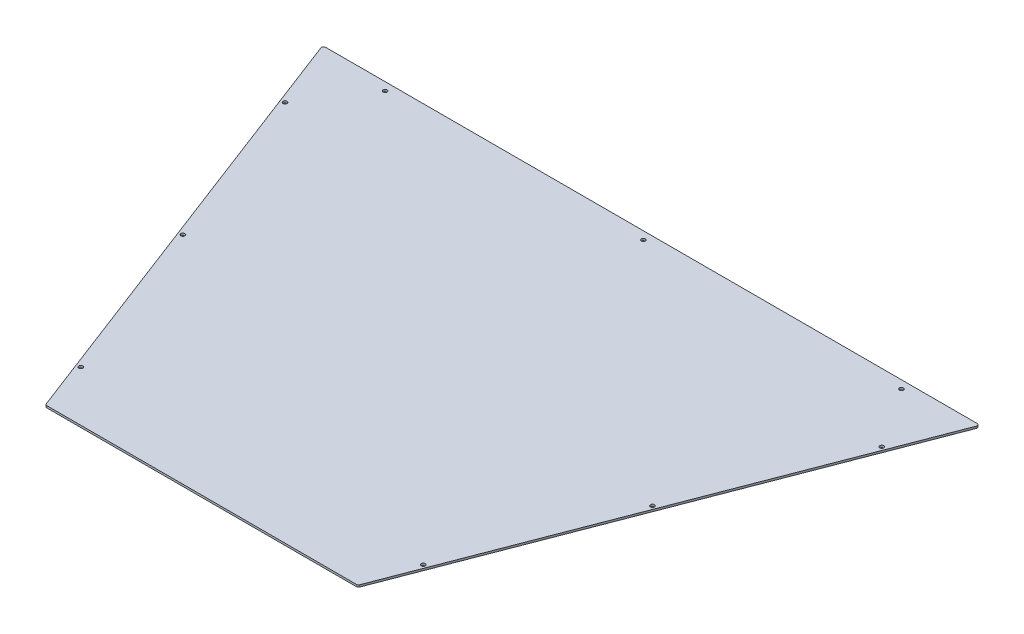
ISO-10303-21;
HEADER;
FILE_DESCRIPTION(('STEP AP214'),'2;1');
FILE_NAME('part.step','',(''),(''),'','','');
FILE_SCHEMA(('AUTOMOTIVE_DESIGN { 1 0 10303 214 1 1 1 1 }'));
ENDSEC;
DATA;
#1=APPLICATION_CONTEXT('core data for automotive mechanical design processes');
#2=APPLICATION_PROTOCOL_DEFINITION('international standard','automotive_design',2000,#1);
#3=PRODUCT_CONTEXT('',#1,'mechanical');
#4=PRODUCT('Part','Part','',(#3));
#5=PRODUCT_RELATED_PRODUCT_CATEGORY('part','',(#4));
#6=PRODUCT_DEFINITION_FORMATION('','',#4);
#7=PRODUCT_DEFINITION_CONTEXT('part definition',#1,'design');
#8=PRODUCT_DEFINITION('design','',#6,#7);
#9=PRODUCT_DEFINITION_SHAPE('','',#8);
#10=(LENGTH_UNIT() NAMED_UNIT(*) SI_UNIT(.MILLI.,.METRE.));
#11=(NAMED_UNIT(*) PLANE_ANGLE_UNIT() SI_UNIT($,.RADIAN.));
#12=(NAMED_UNIT(*) SI_UNIT($,.STERADIAN.) SOLID_ANGLE_UNIT());
#13=UNCERTAINTY_MEASURE_WITH_UNIT(LENGTH_MEASURE(1.E-05),#10,'distance_accuracy_value','');
#14=(GEOMETRIC_REPRESENTATION_CONTEXT(3) GLOBAL_UNCERTAINTY_ASSIGNED_CONTEXT((#13)) GLOBAL_UNIT_ASSIGNED_CONTEXT((#10,
#11,#12)) REPRESENTATION_CONTEXT('',''));
#15=CARTESIAN_POINT('',(0.,0.,0.));
#16=DIRECTION('',(0.,0.,1.));
#17=DIRECTION('',(1.,0.,0.));
#18=AXIS2_PLACEMENT_3D('',#15,#16,#17);
#19=CARTESIAN_POINT('',(-517.525,3.175,-708.025));
#20=DIRECTION('',(0.933656419059452,0.,-0.358169919380566));
#21=DIRECTION('',(-0.358169919380566,0.,-0.933656419059452));
#22=AXIS2_PLACEMENT_3D('',#19,#20,#21);
#23=PLANE('',#22);
#24=DIRECTION('',(0.358169919380566,0.,0.933656419059452));
#25=VECTOR('',#24,1.);
#26=CARTESIAN_POINT('',(-517.525,3.175,-708.025));
#27=LINE('',#26,#25);
#28=CARTESIAN_POINT('',(-515.870754892375,3.175,-703.712810505967));
#29=VERTEX_POINT('',#28);
#30=CARTESIAN_POINT('',(-246.693707478582,3.175,-2.03781050596674));
#31=VERTEX_POINT('',#30);
#32=EDGE_CURVE('E126',#29,#31,#27,.T.);
#33=ORIENTED_EDGE('',*,*,#32,.F.);
#34=DIRECTION('',(0.,-1.,0.));
#35=VECTOR('',#34,1.);
#36=CARTESIAN_POINT('',(-515.870754892375,3.175,-703.712810505967));
#37=LINE('',#36,#35);
#38=CARTESIAN_POINT('',(-515.870754892375,0.,-703.712810505967));
#39=VERTEX_POINT('',#38);
#40=EDGE_CURVE('E152',#29,#39,#37,.T.);
#41=ORIENTED_EDGE('',*,*,#40,.T.);
#42=DIRECTION('',(0.358169919380566,0.,0.933656419059452));
#43=VECTOR('',#42,1.);
#44=CARTESIAN_POINT('',(-517.525,0.,-708.025));
#45=LINE('',#44,#43);
#46=CARTESIAN_POINT('',(-246.693707478582,0.,-2.03781050596674));
#47=VERTEX_POINT('',#46);
#48=EDGE_CURVE('E158',#39,#47,#45,.T.);
#49=ORIENTED_EDGE('',*,*,#48,.T.);
#50=DIRECTION('',(0.,-1.,0.));
#51=VECTOR('',#50,1.);
#52=CARTESIAN_POINT('',(-246.693707478582,3.175,-2.03781050596674));
#53=LINE('',#52,#51);
#54=EDGE_CURVE('E150',#47,#31,#53,.F.);
#55=ORIENTED_EDGE('',*,*,#54,.T.);
#56=EDGE_LOOP('',(#33,#41,#49,#55));
#57=FACE_BOUND('',#56,.T.);
#58=ADVANCED_FACE('F34',(#57),#23,.F.);
#59=CARTESIAN_POINT('',(-245.911961206897,3.175,0.));
#60=DIRECTION('',(0.,0.,-1.));
#61=DIRECTION('',(-1.,0.,0.));
#62=AXIS2_PLACEMENT_3D('',#59,#60,#61);
#63=PLANE('',#62);
#64=DIRECTION('',(1.,0.,0.));
#65=VECTOR('',#64,1.);
#66=CARTESIAN_POINT('',(-245.911961206897,3.175,0.));
#67=LINE('',#66,#65);
#68=CARTESIAN_POINT('',(-243.729348348068,3.175,0.));
#69=VERTEX_POINT('',#68);
#70=CARTESIAN_POINT('',(243.729348348068,3.175,0.));
#71=VERTEX_POINT('',#70);
#72=EDGE_CURVE('E129',#69,#71,#67,.T.);
#73=ORIENTED_EDGE('',*,*,#72,.F.);
#74=DIRECTION('',(0.,-1.,0.));
#75=VECTOR('',#74,1.);
#76=CARTESIAN_POINT('',(-243.729348348068,3.175,0.));
#77=LINE('',#76,#75);
#78=CARTESIAN_POINT('',(-243.729348348068,0.,0.));
#79=VERTEX_POINT('',#78);
#80=EDGE_CURVE('E11',#69,#79,#77,.T.);
#81=ORIENTED_EDGE('',*,*,#80,.T.);
#82=DIRECTION('',(1.,0.,0.));
#83=VECTOR('',#82,1.);
#84=CARTESIAN_POINT('',(-245.911961206897,0.,0.));
#85=LINE('',#84,#83);
#86=CARTESIAN_POINT('',(243.729348348068,0.,0.));
#87=VERTEX_POINT('',#86);
#88=EDGE_CURVE('E131',#79,#87,#85,.T.);
#89=ORIENTED_EDGE('',*,*,#88,.T.);
#90=DIRECTION('',(0.,-1.,0.));
#91=VECTOR('',#90,1.);
#92=CARTESIAN_POINT('',(243.729348348068,3.175,0.));
#93=LINE('',#92,#91);
#94=EDGE_CURVE('E42',#87,#71,#93,.F.);
#95=ORIENTED_EDGE('',*,*,#94,.T.);
#96=EDGE_LOOP('',(#73,#81,#89,#95));
#97=FACE_BOUND('',#96,.T.);
#98=ADVANCED_FACE('F252',(#97),#63,.F.);
#99=CARTESIAN_POINT('',(245.911961206897,3.175,0.));
#100=DIRECTION('',(-0.933656419059452,0.,-0.358169919380566));
#101=DIRECTION('',(-0.358169919380566,0.,0.933656419059452));
#102=AXIS2_PLACEMENT_3D('',#99,#100,#101);
#103=PLANE('',#102);
#104=DIRECTION('',(0.358169919380566,0.,-0.933656419059452));
#105=VECTOR('',#104,1.);
#106=CARTESIAN_POINT('',(245.911961206897,0.,0.));
#107=LINE('',#106,#105);
#108=CARTESIAN_POINT('',(246.693707478582,0.,-2.03781050596671));
#109=VERTEX_POINT('',#108);
#110=CARTESIAN_POINT('',(515.870754892375,0.,-703.712810505967));
#111=VERTEX_POINT('',#110);
#112=EDGE_CURVE('E127',#109,#111,#107,.T.);
#113=ORIENTED_EDGE('',*,*,#112,.T.);
#114=DIRECTION('',(0.,-1.,0.));
#115=VECTOR('',#114,1.);
#116=CARTESIAN_POINT('',(515.870754892375,3.175,-703.712810505967));
#117=LINE('',#116,#115);
#118=CARTESIAN_POINT('',(515.870754892375,3.175,-703.712810505967));
#119=VERTEX_POINT('',#118);
#120=EDGE_CURVE('E105',#111,#119,#117,.F.);
#121=ORIENTED_EDGE('',*,*,#120,.T.);
#122=DIRECTION('',(0.358169919380566,0.,-0.933656419059452));
#123=VECTOR('',#122,1.);
#124=CARTESIAN_POINT('',(245.911961206897,3.175,0.));
#125=LINE('',#124,#123);
#126=CARTESIAN_POINT('',(246.693707478582,3.175,-2.03781050596671));
#127=VERTEX_POINT('',#126);
#128=EDGE_CURVE('E170',#127,#119,#125,.T.);
#129=ORIENTED_EDGE('',*,*,#128,.F.);
#130=DIRECTION('',(0.,-1.,0.));
#131=VECTOR('',#130,1.);
#132=CARTESIAN_POINT('',(246.693707478582,3.175,-2.0378105059667));
#133=LINE('',#132,#131);
#134=EDGE_CURVE('E110',#127,#109,#133,.T.);
#135=ORIENTED_EDGE('',*,*,#134,.T.);
#136=EDGE_LOOP('',(#113,#121,#129,#135));
#137=FACE_BOUND('',#136,.T.);
#138=ADVANCED_FACE('F250',(#137),#103,.F.);
#139=CARTESIAN_POINT('',(517.525,3.175,-708.025));
#140=DIRECTION('',(0.,0.,1.));
#141=DIRECTION('',(1.,0.,0.));
#142=AXIS2_PLACEMENT_3D('',#139,#140,#141);
#143=PLANE('',#142);
#144=DIRECTION('',(-1.,0.,0.));
#145=VECTOR('',#144,1.);
#146=CARTESIAN_POINT('',(517.525,3.175,-708.025));
#147=LINE('',#146,#145);
#148=CARTESIAN_POINT('',(512.906395761861,3.175,-708.025));
#149=VERTEX_POINT('',#148);
#150=CARTESIAN_POINT('',(-512.906395761861,3.175,-708.025));
#151=VERTEX_POINT('',#150);
#152=EDGE_CURVE('E120',#149,#151,#147,.T.);
#153=ORIENTED_EDGE('',*,*,#152,.F.);
#154=DIRECTION('',(0.,-1.,0.));
#155=VECTOR('',#154,1.);
#156=CARTESIAN_POINT('',(512.906395761861,3.175,-708.025));
#157=LINE('',#156,#155);
#158=CARTESIAN_POINT('',(512.906395761861,0.,-708.025));
#159=VERTEX_POINT('',#158);
#160=EDGE_CURVE('E104',#149,#159,#157,.T.);
#161=ORIENTED_EDGE('',*,*,#160,.T.);
#162=DIRECTION('',(-1.,0.,0.));
#163=VECTOR('',#162,1.);
#164=CARTESIAN_POINT('',(517.525,0.,-708.025));
#165=LINE('',#164,#163);
#166=CARTESIAN_POINT('',(-512.906395761861,0.,-708.025));
#167=VERTEX_POINT('',#166);
#168=EDGE_CURVE('E117',#159,#167,#165,.T.);
#169=ORIENTED_EDGE('',*,*,#168,.T.);
#170=DIRECTION('',(0.,-1.,0.));
#171=VECTOR('',#170,1.);
#172=CARTESIAN_POINT('',(-512.906395761861,3.175,-708.025));
#173=LINE('',#172,#171);
#174=EDGE_CURVE('E122',#167,#151,#173,.F.);
#175=ORIENTED_EDGE('',*,*,#174,.T.);
#176=EDGE_LOOP('',(#153,#161,#169,#175));
#177=FACE_BOUND('',#176,.T.);
#178=ADVANCED_FACE('F116',(#177),#143,.F.);
#179=CARTESIAN_POINT('',(0.,3.175,0.));
#180=DIRECTION('',(0.,1.,0.));
#181=DIRECTION('',(0.,0.,1.));
#182=AXIS2_PLACEMENT_3D('',#179,#180,#181);
#183=PLANE('',#182);
#184=CARTESIAN_POINT('',(-406.4,3.175,-695.325));
#185=DIRECTION('',(0.,1.,0.));
#186=DIRECTION('',(0.,0.,1.));
#187=AXIS2_PLACEMENT_3D('',#184,#185,#186);
#188=CIRCLE('',#187,3.17499999999998);
#189=CARTESIAN_POINT('',(-406.4,3.175,-692.15));
#190=VERTEX_POINT('',#189);
#191=EDGE_CURVE('E221',#190,#190,#188,.T.);
#192=ORIENTED_EDGE('',*,*,#191,.F.);
#193=EDGE_LOOP('',(#192));
#194=FACE_BOUND('',#193,.T.);
#195=CARTESIAN_POINT('',(0.,3.175,-695.325));
#196=DIRECTION('',(0.,1.,0.));
#197=DIRECTION('',(0.,0.,1.));
#198=AXIS2_PLACEMENT_3D('',#195,#196,#197);
#199=CIRCLE('',#198,3.175);
#200=CARTESIAN_POINT('',(0.,3.175,-692.15));
#201=VERTEX_POINT('',#200);
#202=EDGE_CURVE('E215',#201,#201,#199,.T.);
#203=ORIENTED_EDGE('',*,*,#202,.F.);
#204=EDGE_LOOP('',(#203));
#205=FACE_BOUND('',#204,.T.);
#206=CARTESIAN_POINT('',(406.4,3.175,-695.325));
#207=DIRECTION('',(0.,1.,0.));
#208=DIRECTION('',(0.,0.,1.));
#209=AXIS2_PLACEMENT_3D('',#206,#207,#208);
#210=CIRCLE('',#209,3.17499999999998);
#211=CARTESIAN_POINT('',(406.4,3.175,-692.15));
#212=VERTEX_POINT('',#211);
#213=EDGE_CURVE('E209',#212,#212,#210,.T.);
#214=ORIENTED_EDGE('',*,*,#213,.F.);
#215=EDGE_LOOP('',(#214));
#216=FACE_BOUND('',#215,.T.);
#217=CARTESIAN_POINT('',(-469.681706804821,3.175,-601.038913991178));
#218=DIRECTION('',(0.,1.,0.));
#219=DIRECTION('',(0.,0.,1.));
#220=AXIS2_PLACEMENT_3D('',#217,#218,#219);
#221=CIRCLE('',#220,3.17499999999998);
#222=CARTESIAN_POINT('',(-469.681706804821,3.175,-597.863913991177));
#223=VERTEX_POINT('',#222);
#224=EDGE_CURVE('E203',#223,#223,#221,.T.);
#225=ORIENTED_EDGE('',*,*,#224,.F.);
#226=EDGE_LOOP('',(#225));
#227=FACE_BOUND('',#226,.T.);
#228=CARTESIAN_POINT('',(-369.609031329891,3.175,-340.175310505967));
#229=DIRECTION('',(0.,1.,0.));
#230=DIRECTION('',(0.,0.,1.));
#231=AXIS2_PLACEMENT_3D('',#228,#229,#230);
#232=CIRCLE('',#231,3.17499999999998);
#233=CARTESIAN_POINT('',(-369.609031329891,3.175,-337.000310505967));
#234=VERTEX_POINT('',#233);
#235=EDGE_CURVE('E197',#234,#234,#232,.T.);
#236=ORIENTED_EDGE('',*,*,#235,.F.);
#237=EDGE_LOOP('',(#236));
#238=FACE_BOUND('',#237,.T.);
#239=CARTESIAN_POINT('',(-269.536355854961,3.175,-79.3117070207557));
#240=DIRECTION('',(0.,1.,0.));
#241=DIRECTION('',(0.,0.,1.));
#242=AXIS2_PLACEMENT_3D('',#239,#240,#241);
#243=CIRCLE('',#242,3.17499999999998);
#244=CARTESIAN_POINT('',(-269.536355854961,3.175,-76.1367070207558));
#245=VERTEX_POINT('',#244);
#246=EDGE_CURVE('E191',#245,#245,#243,.T.);
#247=ORIENTED_EDGE('',*,*,#246,.F.);
#248=EDGE_LOOP('',(#247));
#249=FACE_BOUND('',#248,.T.);
#250=CARTESIAN_POINT('',(269.536355854961,3.175,-79.3117070207555));
#251=DIRECTION('',(0.,1.,0.));
#252=DIRECTION('',(0.,0.,1.));
#253=AXIS2_PLACEMENT_3D('',#250,#251,#252);
#254=CIRCLE('',#253,3.17499999999998);
#255=CARTESIAN_POINT('',(269.536355854961,3.175,-76.1367070207555));
#256=VERTEX_POINT('',#255);
#257=EDGE_CURVE('E185',#256,#256,#254,.T.);
#258=ORIENTED_EDGE('',*,*,#257,.F.);
#259=EDGE_LOOP('',(#258));
#260=FACE_BOUND('',#259,.T.);
#261=CARTESIAN_POINT('',(369.609031329891,3.175,-340.175310505967));
#262=DIRECTION('',(0.,1.,0.));
#263=DIRECTION('',(0.,0.,1.));
#264=AXIS2_PLACEMENT_3D('',#261,#262,#263);
#265=CIRCLE('',#264,3.17499999999998);
#266=CARTESIAN_POINT('',(369.609031329891,3.175,-337.000310505967));
#267=VERTEX_POINT('',#266);
#268=EDGE_CURVE('E179',#267,#267,#265,.T.);
#269=ORIENTED_EDGE('',*,*,#268,.F.);
#270=EDGE_LOOP('',(#269));
#271=FACE_BOUND('',#270,.T.);
#272=CARTESIAN_POINT('',(469.681706804821,3.175,-601.038913991178));
#273=DIRECTION('',(0.,1.,0.));
#274=DIRECTION('',(0.,0.,1.));
#275=AXIS2_PLACEMENT_3D('',#272,#273,#274);
#276=CIRCLE('',#275,3.17499999999998);
#277=CARTESIAN_POINT('',(469.681706804821,3.175,-597.863913991178));
#278=VERTEX_POINT('',#277);
#279=EDGE_CURVE('E166',#278,#278,#276,.T.);
#280=ORIENTED_EDGE('',*,*,#279,.F.);
#281=EDGE_LOOP('',(#280));
#282=FACE_BOUND('',#281,.T.);
#283=ORIENTED_EDGE('',*,*,#128,.T.);
#284=CARTESIAN_POINT('',(512.906395761861,3.175,-704.85));
#285=DIRECTION('',(0.,1.,0.));
#286=DIRECTION('',(0.,0.,1.));
#287=AXIS2_PLACEMENT_3D('',#284,#285,#286);
#288=CIRCLE('',#287,3.175);
#289=EDGE_CURVE('E148',#119,#149,#288,.T.);
#290=ORIENTED_EDGE('',*,*,#289,.T.);
#291=ORIENTED_EDGE('',*,*,#152,.T.);
#292=CARTESIAN_POINT('',(-512.906395761861,3.175,-704.85));
#293=DIRECTION('',(0.,1.,0.));
#294=DIRECTION('',(0.,0.,1.));
#295=AXIS2_PLACEMENT_3D('',#292,#293,#294);
#296=CIRCLE('',#295,3.175);
#297=EDGE_CURVE('E146',#151,#29,#296,.T.);
#298=ORIENTED_EDGE('',*,*,#297,.T.);
#299=ORIENTED_EDGE('',*,*,#32,.T.);
#300=CARTESIAN_POINT('',(-243.729348348068,3.175,-3.175));
#301=DIRECTION('',(0.,1.,0.));
#302=DIRECTION('',(0.,0.,1.));
#303=AXIS2_PLACEMENT_3D('',#300,#301,#302);
#304=CIRCLE('',#303,3.175);
#305=EDGE_CURVE('E55',#31,#69,#304,.T.);
#306=ORIENTED_EDGE('',*,*,#305,.T.);
#307=ORIENTED_EDGE('',*,*,#72,.T.);
#308=CARTESIAN_POINT('',(243.729348348068,3.175,-3.175));
#309=DIRECTION('',(0.,1.,0.));
#310=DIRECTION('',(0.,0.,1.));
#311=AXIS2_PLACEMENT_3D('',#308,#309,#310);
#312=CIRCLE('',#311,3.175);
#313=EDGE_CURVE('E143',#71,#127,#312,.T.);
#314=ORIENTED_EDGE('',*,*,#313,.T.);
#315=EDGE_LOOP('',(#283,#290,#291,#298,#299,#306,#307,#314));
#316=FACE_BOUND('',#315,.T.);
#317=ADVANCED_FACE('F227',(#194,#205,#216,#227,#238,#249,#260,#271,#282,#316),#183,.T.);
#318=CARTESIAN_POINT('',(0.,0.,0.));
#319=DIRECTION('',(0.,1.,0.));
#320=DIRECTION('',(0.,0.,1.));
#321=AXIS2_PLACEMENT_3D('',#318,#319,#320);
#322=PLANE('',#321);
#323=CARTESIAN_POINT('',(-406.4,0.,-695.325));
#324=DIRECTION('',(0.,1.,0.));
#325=DIRECTION('',(0.,0.,1.));
#326=AXIS2_PLACEMENT_3D('',#323,#324,#325);
#327=CIRCLE('',#326,3.17499999999998);
#328=CARTESIAN_POINT('',(-406.4,0.,-692.15));
#329=VERTEX_POINT('',#328);
#330=EDGE_CURVE('E218',#329,#329,#327,.T.);
#331=ORIENTED_EDGE('',*,*,#330,.T.);
#332=EDGE_LOOP('',(#331));
#333=FACE_BOUND('',#332,.T.);
#334=CARTESIAN_POINT('',(0.,0.,-695.325));
#335=DIRECTION('',(0.,1.,0.));
#336=DIRECTION('',(0.,0.,1.));
#337=AXIS2_PLACEMENT_3D('',#334,#335,#336);
#338=CIRCLE('',#337,3.175);
#339=CARTESIAN_POINT('',(0.,0.,-692.15));
#340=VERTEX_POINT('',#339);
#341=EDGE_CURVE('E212',#340,#340,#338,.T.);
#342=ORIENTED_EDGE('',*,*,#341,.T.);
#343=EDGE_LOOP('',(#342));
#344=FACE_BOUND('',#343,.T.);
#345=CARTESIAN_POINT('',(406.4,0.,-695.325));
#346=DIRECTION('',(0.,1.,0.));
#347=DIRECTION('',(0.,0.,1.));
#348=AXIS2_PLACEMENT_3D('',#345,#346,#347);
#349=CIRCLE('',#348,3.17499999999998);
#350=CARTESIAN_POINT('',(406.4,0.,-692.15));
#351=VERTEX_POINT('',#350);
#352=EDGE_CURVE('E206',#351,#351,#349,.T.);
#353=ORIENTED_EDGE('',*,*,#352,.T.);
#354=EDGE_LOOP('',(#353));
#355=FACE_BOUND('',#354,.T.);
#356=CARTESIAN_POINT('',(-469.681706804821,0.,-601.038913991178));
#357=DIRECTION('',(0.,1.,0.));
#358=DIRECTION('',(0.,0.,1.));
#359=AXIS2_PLACEMENT_3D('',#356,#357,#358);
#360=CIRCLE('',#359,3.17499999999998);
#361=CARTESIAN_POINT('',(-469.681706804821,0.,-597.863913991177));
#362=VERTEX_POINT('',#361);
#363=EDGE_CURVE('E200',#362,#362,#360,.T.);
#364=ORIENTED_EDGE('',*,*,#363,.T.);
#365=EDGE_LOOP('',(#364));
#366=FACE_BOUND('',#365,.T.);
#367=CARTESIAN_POINT('',(-369.609031329891,0.,-340.175310505967));
#368=DIRECTION('',(0.,1.,0.));
#369=DIRECTION('',(0.,0.,1.));
#370=AXIS2_PLACEMENT_3D('',#367,#368,#369);
#371=CIRCLE('',#370,3.17499999999998);
#372=CARTESIAN_POINT('',(-369.609031329891,0.,-337.000310505967));
#373=VERTEX_POINT('',#372);
#374=EDGE_CURVE('E194',#373,#373,#371,.T.);
#375=ORIENTED_EDGE('',*,*,#374,.T.);
#376=EDGE_LOOP('',(#375));
#377=FACE_BOUND('',#376,.T.);
#378=CARTESIAN_POINT('',(-269.536355854961,0.,-79.3117070207557));
#379=DIRECTION('',(0.,1.,0.));
#380=DIRECTION('',(0.,0.,1.));
#381=AXIS2_PLACEMENT_3D('',#378,#379,#380);
#382=CIRCLE('',#381,3.17499999999998);
#383=CARTESIAN_POINT('',(-269.536355854961,0.,-76.1367070207558));
#384=VERTEX_POINT('',#383);
#385=EDGE_CURVE('E188',#384,#384,#382,.T.);
#386=ORIENTED_EDGE('',*,*,#385,.T.);
#387=EDGE_LOOP('',(#386));
#388=FACE_BOUND('',#387,.T.);
#389=CARTESIAN_POINT('',(269.536355854961,0.,-79.3117070207555));
#390=DIRECTION('',(0.,1.,0.));
#391=DIRECTION('',(0.,0.,1.));
#392=AXIS2_PLACEMENT_3D('',#389,#390,#391);
#393=CIRCLE('',#392,3.17499999999998);
#394=CARTESIAN_POINT('',(269.536355854961,0.,-76.1367070207555));
#395=VERTEX_POINT('',#394);
#396=EDGE_CURVE('E182',#395,#395,#393,.T.);
#397=ORIENTED_EDGE('',*,*,#396,.T.);
#398=EDGE_LOOP('',(#397));
#399=FACE_BOUND('',#398,.T.);
#400=CARTESIAN_POINT('',(369.609031329891,0.,-340.175310505967));
#401=DIRECTION('',(0.,1.,0.));
#402=DIRECTION('',(0.,0.,1.));
#403=AXIS2_PLACEMENT_3D('',#400,#401,#402);
#404=CIRCLE('',#403,3.17499999999998);
#405=CARTESIAN_POINT('',(369.609031329891,0.,-337.000310505967));
#406=VERTEX_POINT('',#405);
#407=EDGE_CURVE('E176',#406,#406,#404,.T.);
#408=ORIENTED_EDGE('',*,*,#407,.T.);
#409=EDGE_LOOP('',(#408));
#410=FACE_BOUND('',#409,.T.);
#411=CARTESIAN_POINT('',(469.681706804821,0.,-601.038913991178));
#412=DIRECTION('',(0.,1.,0.));
#413=DIRECTION('',(0.,0.,1.));
#414=AXIS2_PLACEMENT_3D('',#411,#412,#413);
#415=CIRCLE('',#414,3.17499999999998);
#416=CARTESIAN_POINT('',(469.681706804821,0.,-597.863913991178));
#417=VERTEX_POINT('',#416);
#418=EDGE_CURVE('E163',#417,#417,#415,.T.);
#419=ORIENTED_EDGE('',*,*,#418,.T.);
#420=EDGE_LOOP('',(#419));
#421=FACE_BOUND('',#420,.T.);
#422=ORIENTED_EDGE('',*,*,#168,.F.);
#423=CARTESIAN_POINT('',(512.906395761861,0.,-704.85));
#424=DIRECTION('',(0.,1.,0.));
#425=DIRECTION('',(0.,0.,1.));
#426=AXIS2_PLACEMENT_3D('',#423,#424,#425);
#427=CIRCLE('',#426,3.175);
#428=EDGE_CURVE('E100',#159,#111,#427,.F.);
#429=ORIENTED_EDGE('',*,*,#428,.T.);
#430=ORIENTED_EDGE('',*,*,#112,.F.);
#431=CARTESIAN_POINT('',(243.729348348068,0.,-3.175));
#432=DIRECTION('',(0.,1.,0.));
#433=DIRECTION('',(0.,0.,1.));
#434=AXIS2_PLACEMENT_3D('',#431,#432,#433);
#435=CIRCLE('',#434,3.175);
#436=EDGE_CURVE('E121',#109,#87,#435,.F.);
#437=ORIENTED_EDGE('',*,*,#436,.T.);
#438=ORIENTED_EDGE('',*,*,#88,.F.);
#439=CARTESIAN_POINT('',(-243.729348348068,0.,-3.175));
#440=DIRECTION('',(0.,1.,0.));
#441=DIRECTION('',(0.,0.,1.));
#442=AXIS2_PLACEMENT_3D('',#439,#440,#441);
#443=CIRCLE('',#442,3.175);
#444=EDGE_CURVE('E137',#79,#47,#443,.F.);
#445=ORIENTED_EDGE('',*,*,#444,.T.);
#446=ORIENTED_EDGE('',*,*,#48,.F.);
#447=CARTESIAN_POINT('',(-512.906395761861,0.,-704.85));
#448=DIRECTION('',(0.,1.,0.));
#449=DIRECTION('',(0.,0.,1.));
#450=AXIS2_PLACEMENT_3D('',#447,#448,#449);
#451=CIRCLE('',#450,3.175);
#452=EDGE_CURVE('E111',#39,#167,#451,.F.);
#453=ORIENTED_EDGE('',*,*,#452,.T.);
#454=EDGE_LOOP('',(#422,#429,#430,#437,#438,#445,#446,#453));
#455=FACE_BOUND('',#454,.T.);
#456=ADVANCED_FACE('F124',(#333,#344,#355,#366,#377,#388,#399,#410,#421,#455),#322,.F.);
#457=CARTESIAN_POINT('',(512.906395761861,3.175,-704.85));
#458=DIRECTION('',(0.,-1.,0.));
#459=DIRECTION('',(0.,0.,-1.));
#460=AXIS2_PLACEMENT_3D('',#457,#458,#459);
#461=CYLINDRICAL_SURFACE('',#460,3.175);
#462=ORIENTED_EDGE('',*,*,#289,.F.);
#463=ORIENTED_EDGE('',*,*,#120,.F.);
#464=ORIENTED_EDGE('',*,*,#428,.F.);
#465=ORIENTED_EDGE('',*,*,#160,.F.);
#466=EDGE_LOOP('',(#462,#463,#464,#465));
#467=FACE_BOUND('',#466,.T.);
#468=ADVANCED_FACE('F103',(#467),#461,.T.);
#469=CARTESIAN_POINT('',(-512.906395761861,3.175,-704.85));
#470=DIRECTION('',(0.,-1.,0.));
#471=DIRECTION('',(0.,0.,-1.));
#472=AXIS2_PLACEMENT_3D('',#469,#470,#471);
#473=CYLINDRICAL_SURFACE('',#472,3.175);
#474=ORIENTED_EDGE('',*,*,#297,.F.);
#475=ORIENTED_EDGE('',*,*,#174,.F.);
#476=ORIENTED_EDGE('',*,*,#452,.F.);
#477=ORIENTED_EDGE('',*,*,#40,.F.);
#478=EDGE_LOOP('',(#474,#475,#476,#477));
#479=FACE_BOUND('',#478,.T.);
#480=ADVANCED_FACE('F256',(#479),#473,.T.);
#481=CARTESIAN_POINT('',(-243.729348348068,3.175,-3.175));
#482=DIRECTION('',(0.,-1.,0.));
#483=DIRECTION('',(0.,0.,-1.));
#484=AXIS2_PLACEMENT_3D('',#481,#482,#483);
#485=CYLINDRICAL_SURFACE('',#484,3.175);
#486=ORIENTED_EDGE('',*,*,#305,.F.);
#487=ORIENTED_EDGE('',*,*,#54,.F.);
#488=ORIENTED_EDGE('',*,*,#444,.F.);
#489=ORIENTED_EDGE('',*,*,#80,.F.);
#490=EDGE_LOOP('',(#486,#487,#488,#489));
#491=FACE_BOUND('',#490,.T.);
#492=ADVANCED_FACE('F255',(#491),#485,.T.);
#493=CARTESIAN_POINT('',(243.729348348068,3.175,-3.175));
#494=DIRECTION('',(0.,-1.,0.));
#495=DIRECTION('',(0.,0.,-1.));
#496=AXIS2_PLACEMENT_3D('',#493,#494,#495);
#497=CYLINDRICAL_SURFACE('',#496,3.175);
#498=ORIENTED_EDGE('',*,*,#313,.F.);
#499=ORIENTED_EDGE('',*,*,#94,.F.);
#500=ORIENTED_EDGE('',*,*,#436,.F.);
#501=ORIENTED_EDGE('',*,*,#134,.F.);
#502=EDGE_LOOP('',(#498,#499,#500,#501));
#503=FACE_BOUND('',#502,.T.);
#504=ADVANCED_FACE('F36',(#503),#497,.T.);
#505=CARTESIAN_POINT('',(469.681706804821,3.175,-601.038913991178));
#506=DIRECTION('',(0.,1.,0.));
#507=DIRECTION('',(0.,0.,1.));
#508=AXIS2_PLACEMENT_3D('',#505,#506,#507);
#509=CYLINDRICAL_SURFACE('',#508,3.17499999999998);
#510=ORIENTED_EDGE('',*,*,#418,.F.);
#511=EDGE_LOOP('',(#510));
#512=FACE_BOUND('',#511,.T.);
#513=ORIENTED_EDGE('',*,*,#279,.T.);
#514=EDGE_LOOP('',(#513));
#515=FACE_BOUND('',#514,.T.);
#516=ADVANCED_FACE('F278',(#512,#515),#509,.F.);
#517=CARTESIAN_POINT('',(369.609031329891,3.175,-340.175310505967));
#518=DIRECTION('',(0.,1.,0.));
#519=DIRECTION('',(0.,0.,1.));
#520=AXIS2_PLACEMENT_3D('',#517,#518,#519);
#521=CYLINDRICAL_SURFACE('',#520,3.17499999999998);
#522=ORIENTED_EDGE('',*,*,#407,.F.);
#523=EDGE_LOOP('',(#522));
#524=FACE_BOUND('',#523,.T.);
#525=ORIENTED_EDGE('',*,*,#268,.T.);
#526=EDGE_LOOP('',(#525));
#527=FACE_BOUND('',#526,.T.);
#528=ADVANCED_FACE('F281',(#524,#527),#521,.F.);
#529=CARTESIAN_POINT('',(269.536355854961,3.175,-79.3117070207555));
#530=DIRECTION('',(0.,1.,0.));
#531=DIRECTION('',(0.,0.,1.));
#532=AXIS2_PLACEMENT_3D('',#529,#530,#531);
#533=CYLINDRICAL_SURFACE('',#532,3.17499999999998);
#534=ORIENTED_EDGE('',*,*,#396,.F.);
#535=EDGE_LOOP('',(#534));
#536=FACE_BOUND('',#535,.T.);
#537=ORIENTED_EDGE('',*,*,#257,.T.);
#538=EDGE_LOOP('',(#537));
#539=FACE_BOUND('',#538,.T.);
#540=ADVANCED_FACE('F285',(#536,#539),#533,.F.);
#541=CARTESIAN_POINT('',(-269.536355854961,3.175,-79.3117070207557));
#542=DIRECTION('',(0.,1.,0.));
#543=DIRECTION('',(0.,0.,1.));
#544=AXIS2_PLACEMENT_3D('',#541,#542,#543);
#545=CYLINDRICAL_SURFACE('',#544,3.17499999999998);
#546=ORIENTED_EDGE('',*,*,#385,.F.);
#547=EDGE_LOOP('',(#546));
#548=FACE_BOUND('',#547,.T.);
#549=ORIENTED_EDGE('',*,*,#246,.T.);
#550=EDGE_LOOP('',(#549));
#551=FACE_BOUND('',#550,.T.);
#552=ADVANCED_FACE('F289',(#548,#551),#545,.F.);
#553=CARTESIAN_POINT('',(-369.609031329891,3.175,-340.175310505967));
#554=DIRECTION('',(0.,1.,0.));
#555=DIRECTION('',(0.,0.,1.));
#556=AXIS2_PLACEMENT_3D('',#553,#554,#555);
#557=CYLINDRICAL_SURFACE('',#556,3.17499999999998);
#558=ORIENTED_EDGE('',*,*,#374,.F.);
#559=EDGE_LOOP('',(#558));
#560=FACE_BOUND('',#559,.T.);
#561=ORIENTED_EDGE('',*,*,#235,.T.);
#562=EDGE_LOOP('',(#561));
#563=FACE_BOUND('',#562,.T.);
#564=ADVANCED_FACE('F293',(#560,#563),#557,.F.);
#565=CARTESIAN_POINT('',(-469.681706804821,3.175,-601.038913991178));
#566=DIRECTION('',(0.,1.,0.));
#567=DIRECTION('',(0.,0.,1.));
#568=AXIS2_PLACEMENT_3D('',#565,#566,#567);
#569=CYLINDRICAL_SURFACE('',#568,3.17499999999998);
#570=ORIENTED_EDGE('',*,*,#363,.F.);
#571=EDGE_LOOP('',(#570));
#572=FACE_BOUND('',#571,.T.);
#573=ORIENTED_EDGE('',*,*,#224,.T.);
#574=EDGE_LOOP('',(#573));
#575=FACE_BOUND('',#574,.T.);
#576=ADVANCED_FACE('F297',(#572,#575),#569,.F.);
#577=CARTESIAN_POINT('',(406.4,3.175,-695.325));
#578=DIRECTION('',(0.,1.,0.));
#579=DIRECTION('',(0.,0.,1.));
#580=AXIS2_PLACEMENT_3D('',#577,#578,#579);
#581=CYLINDRICAL_SURFACE('',#580,3.17499999999998);
#582=ORIENTED_EDGE('',*,*,#352,.F.);
#583=EDGE_LOOP('',(#582));
#584=FACE_BOUND('',#583,.T.);
#585=ORIENTED_EDGE('',*,*,#213,.T.);
#586=EDGE_LOOP('',(#585));
#587=FACE_BOUND('',#586,.T.);
#588=ADVANCED_FACE('F301',(#584,#587),#581,.F.);
#589=CARTESIAN_POINT('',(0.,3.175,-695.325));
#590=DIRECTION('',(0.,1.,0.));
#591=DIRECTION('',(0.,0.,1.));
#592=AXIS2_PLACEMENT_3D('',#589,#590,#591);
#593=CYLINDRICAL_SURFACE('',#592,3.175);
#594=ORIENTED_EDGE('',*,*,#341,.F.);
#595=EDGE_LOOP('',(#594));
#596=FACE_BOUND('',#595,.T.);
#597=ORIENTED_EDGE('',*,*,#202,.T.);
#598=EDGE_LOOP('',(#597));
#599=FACE_BOUND('',#598,.T.);
#600=ADVANCED_FACE('F305',(#596,#599),#593,.F.);
#601=CARTESIAN_POINT('',(-406.4,3.175,-695.325));
#602=DIRECTION('',(0.,1.,0.));
#603=DIRECTION('',(0.,0.,1.));
#604=AXIS2_PLACEMENT_3D('',#601,#602,#603);
#605=CYLINDRICAL_SURFACE('',#604,3.17499999999998);
#606=ORIENTED_EDGE('',*,*,#330,.F.);
#607=EDGE_LOOP('',(#606));
#608=FACE_BOUND('',#607,.T.);
#609=ORIENTED_EDGE('',*,*,#191,.T.);
#610=EDGE_LOOP('',(#609));
#611=FACE_BOUND('',#610,.T.);
#612=ADVANCED_FACE('F225',(#608,#611),#605,.F.);
#613=CLOSED_SHELL('',(#58,#98,#138,#178,#317,#456,#468,#480,#492,#504,#516,#528,#540,#552,#564,
#576,#588,#600,#612));
#614=MANIFOLD_SOLID_BREP('B2',#613);
#615=ADVANCED_BREP_SHAPE_REPRESENTATION('',(#18,#614),#14);
#616=SHAPE_DEFINITION_REPRESENTATION(#9,#615);
ENDSEC;
END-ISO-10303-21;
